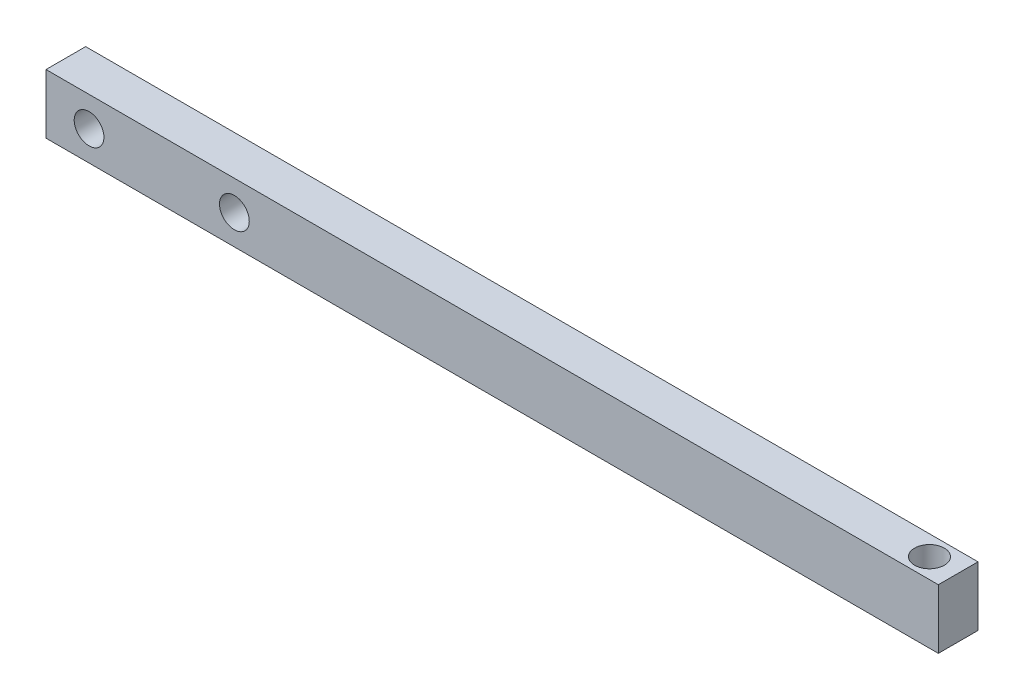
ISO-10303-21;
HEADER;
FILE_DESCRIPTION(('STEP AP214'),'2;1');
FILE_NAME('part.step','',(''),(''),'','','');
FILE_SCHEMA(('AUTOMOTIVE_DESIGN { 1 0 10303 214 1 1 1 1 }'));
ENDSEC;
DATA;
#1=APPLICATION_CONTEXT('core data for automotive mechanical design processes');
#2=APPLICATION_PROTOCOL_DEFINITION('international standard','automotive_design',2000,#1);
#3=PRODUCT_CONTEXT('',#1,'mechanical');
#4=PRODUCT('Part','Part','',(#3));
#5=PRODUCT_RELATED_PRODUCT_CATEGORY('part','',(#4));
#6=PRODUCT_DEFINITION_FORMATION('','',#4);
#7=PRODUCT_DEFINITION_CONTEXT('part definition',#1,'design');
#8=PRODUCT_DEFINITION('design','',#6,#7);
#9=PRODUCT_DEFINITION_SHAPE('','',#8);
#10=(LENGTH_UNIT() NAMED_UNIT(*) SI_UNIT(.MILLI.,.METRE.));
#11=(NAMED_UNIT(*) PLANE_ANGLE_UNIT() SI_UNIT($,.RADIAN.));
#12=(NAMED_UNIT(*) SI_UNIT($,.STERADIAN.) SOLID_ANGLE_UNIT());
#13=UNCERTAINTY_MEASURE_WITH_UNIT(LENGTH_MEASURE(1.E-05),#10,'distance_accuracy_value','');
#14=(GEOMETRIC_REPRESENTATION_CONTEXT(3) GLOBAL_UNCERTAINTY_ASSIGNED_CONTEXT((#13)) GLOBAL_UNIT_ASSIGNED_CONTEXT((#10,
#11,#12)) REPRESENTATION_CONTEXT('',''));
#15=CARTESIAN_POINT('',(0.,0.,0.));
#16=DIRECTION('',(0.,0.,1.));
#17=DIRECTION('',(1.,0.,0.));
#18=AXIS2_PLACEMENT_3D('',#15,#16,#17);
#19=CARTESIAN_POINT('',(508.,-38.0999999999999,50.8));
#20=DIRECTION('',(0.,1.,0.));
#21=DIRECTION('',(-1.,0.,0.));
#22=AXIS2_PLACEMENT_3D('',#19,#20,#21);
#23=PLANE('',#22);
#24=CARTESIAN_POINT('',(471.226971180447,-38.1000000000001,25.4));
#25=DIRECTION('',(0.,1.,0.));
#26=DIRECTION('',(-1.,0.,0.));
#27=AXIS2_PLACEMENT_3D('',#24,#25,#26);
#28=CIRCLE('',#27,19.05);
#29=CARTESIAN_POINT('',(452.176971180447,-38.1000000000001,25.4));
#30=VERTEX_POINT('',#29);
#31=EDGE_CURVE('E105',#30,#30,#28,.T.);
#32=ORIENTED_EDGE('',*,*,#31,.T.);
#33=EDGE_LOOP('',(#32));
#34=FACE_BOUND('',#33,.T.);
#35=DIRECTION('',(1.,0.,0.));
#36=VECTOR('',#35,1.);
#37=CARTESIAN_POINT('',(508.,-38.0999999999999,0.));
#38=LINE('',#37,#36);
#39=CARTESIAN_POINT('',(-635.,-38.1000000000001,0.));
#40=VERTEX_POINT('',#39);
#41=CARTESIAN_POINT('',(508.,-38.0999999999999,0.));
#42=VERTEX_POINT('',#41);
#43=EDGE_CURVE('E60',#40,#42,#38,.T.);
#44=ORIENTED_EDGE('',*,*,#43,.T.);
#45=DIRECTION('',(0.,0.,-1.));
#46=VECTOR('',#45,1.);
#47=CARTESIAN_POINT('',(508.,-38.0999999999999,50.8));
#48=LINE('',#47,#46);
#49=CARTESIAN_POINT('',(508.,-38.0999999999999,50.8));
#50=VERTEX_POINT('',#49);
#51=EDGE_CURVE('E11',#50,#42,#48,.T.);
#52=ORIENTED_EDGE('',*,*,#51,.F.);
#53=DIRECTION('',(1.,0.,0.));
#54=VECTOR('',#53,1.);
#55=CARTESIAN_POINT('',(508.,-38.0999999999999,50.8));
#56=LINE('',#55,#54);
#57=CARTESIAN_POINT('',(-635.,-38.1000000000001,50.8));
#58=VERTEX_POINT('',#57);
#59=EDGE_CURVE('E87',#58,#50,#56,.T.);
#60=ORIENTED_EDGE('',*,*,#59,.F.);
#61=DIRECTION('',(0.,0.,1.));
#62=VECTOR('',#61,1.);
#63=CARTESIAN_POINT('',(-635.,-38.1000000000001,0.));
#64=LINE('',#63,#62);
#65=EDGE_CURVE('E86',#40,#58,#64,.T.);
#66=ORIENTED_EDGE('',*,*,#65,.F.);
#67=EDGE_LOOP('',(#44,#52,#60,#66));
#68=FACE_BOUND('',#67,.T.);
#69=ADVANCED_FACE('F33',(#34,#68),#23,.F.);
#70=CARTESIAN_POINT('',(508.,-38.0999999999999,50.8));
#71=DIRECTION('',(-1.,0.,0.));
#72=DIRECTION('',(0.,0.,1.));
#73=AXIS2_PLACEMENT_3D('',#70,#71,#72);
#74=PLANE('',#73);
#75=DIRECTION('',(0.,1.,0.));
#76=VECTOR('',#75,1.);
#77=CARTESIAN_POINT('',(508.,-38.0999999999999,0.));
#78=LINE('',#77,#76);
#79=CARTESIAN_POINT('',(508.,38.1000000000001,0.));
#80=VERTEX_POINT('',#79);
#81=EDGE_CURVE('E82',#42,#80,#78,.T.);
#82=ORIENTED_EDGE('',*,*,#81,.T.);
#83=DIRECTION('',(0.,0.,-1.));
#84=VECTOR('',#83,1.);
#85=CARTESIAN_POINT('',(508.,38.1000000000001,50.8));
#86=LINE('',#85,#84);
#87=CARTESIAN_POINT('',(508.,38.1000000000001,50.8));
#88=VERTEX_POINT('',#87);
#89=EDGE_CURVE('E41',#88,#80,#86,.T.);
#90=ORIENTED_EDGE('',*,*,#89,.F.);
#91=DIRECTION('',(0.,1.,0.));
#92=VECTOR('',#91,1.);
#93=CARTESIAN_POINT('',(508.,-38.0999999999999,50.8));
#94=LINE('',#93,#92);
#95=EDGE_CURVE('E49',#50,#88,#94,.T.);
#96=ORIENTED_EDGE('',*,*,#95,.F.);
#97=ORIENTED_EDGE('',*,*,#51,.T.);
#98=EDGE_LOOP('',(#82,#90,#96,#97));
#99=FACE_BOUND('',#98,.T.);
#100=ADVANCED_FACE('F123',(#99),#74,.F.);
#101=CARTESIAN_POINT('',(508.,38.1000000000001,50.8));
#102=DIRECTION('',(0.,-1.,0.));
#103=DIRECTION('',(1.,0.,0.));
#104=AXIS2_PLACEMENT_3D('',#101,#102,#103);
#105=PLANE('',#104);
#106=CARTESIAN_POINT('',(471.226971180447,38.1000000000001,25.4));
#107=DIRECTION('',(0.,1.,0.));
#108=DIRECTION('',(-1.,0.,0.));
#109=AXIS2_PLACEMENT_3D('',#106,#107,#108);
#110=CIRCLE('',#109,19.05);
#111=CARTESIAN_POINT('',(452.176971180447,38.1000000000001,25.4));
#112=VERTEX_POINT('',#111);
#113=EDGE_CURVE('E104',#112,#112,#110,.T.);
#114=ORIENTED_EDGE('',*,*,#113,.F.);
#115=EDGE_LOOP('',(#114));
#116=FACE_BOUND('',#115,.T.);
#117=DIRECTION('',(-1.,0.,0.));
#118=VECTOR('',#117,1.);
#119=CARTESIAN_POINT('',(508.,38.1000000000001,0.));
#120=LINE('',#119,#118);
#121=CARTESIAN_POINT('',(-635.,38.0999999999999,0.));
#122=VERTEX_POINT('',#121);
#123=EDGE_CURVE('E68',#80,#122,#120,.T.);
#124=ORIENTED_EDGE('',*,*,#123,.T.);
#125=DIRECTION('',(0.,0.,-1.));
#126=VECTOR('',#125,1.);
#127=CARTESIAN_POINT('',(-635.,38.0999999999999,0.));
#128=LINE('',#127,#126);
#129=CARTESIAN_POINT('',(-635.,38.0999999999999,50.8));
#130=VERTEX_POINT('',#129);
#131=EDGE_CURVE('E94',#130,#122,#128,.T.);
#132=ORIENTED_EDGE('',*,*,#131,.F.);
#133=DIRECTION('',(-1.,0.,0.));
#134=VECTOR('',#133,1.);
#135=CARTESIAN_POINT('',(508.,38.1000000000001,50.8));
#136=LINE('',#135,#134);
#137=EDGE_CURVE('E117',#88,#130,#136,.T.);
#138=ORIENTED_EDGE('',*,*,#137,.F.);
#139=ORIENTED_EDGE('',*,*,#89,.T.);
#140=EDGE_LOOP('',(#124,#132,#138,#139));
#141=FACE_BOUND('',#140,.T.);
#142=ADVANCED_FACE('F121',(#116,#141),#105,.F.);
#143=CARTESIAN_POINT('',(0.,0.,50.8));
#144=DIRECTION('',(0.,0.,1.));
#145=DIRECTION('',(1.,0.,0.));
#146=AXIS2_PLACEMENT_3D('',#143,#144,#145);
#147=PLANE('',#146);
#148=CARTESIAN_POINT('',(-579.845937481373,0.,50.8));
#149=DIRECTION('',(0.,0.,1.));
#150=DIRECTION('',(1.,0.,0.));
#151=AXIS2_PLACEMENT_3D('',#148,#149,#150);
#152=CIRCLE('',#151,19.05);
#153=CARTESIAN_POINT('',(-560.795937481373,0.,50.8));
#154=VERTEX_POINT('',#153);
#155=EDGE_CURVE('E98',#154,#154,#152,.T.);
#156=ORIENTED_EDGE('',*,*,#155,.F.);
#157=EDGE_LOOP('',(#156));
#158=FACE_BOUND('',#157,.T.);
#159=CARTESIAN_POINT('',(-393.7,0.,50.8));
#160=DIRECTION('',(0.,0.,1.));
#161=DIRECTION('',(1.,0.,0.));
#162=AXIS2_PLACEMENT_3D('',#159,#160,#161);
#163=CIRCLE('',#162,19.05);
#164=CARTESIAN_POINT('',(-374.65,0.,50.8));
#165=VERTEX_POINT('',#164);
#166=EDGE_CURVE('E108',#165,#165,#163,.T.);
#167=ORIENTED_EDGE('',*,*,#166,.F.);
#168=EDGE_LOOP('',(#167));
#169=FACE_BOUND('',#168,.T.);
#170=ORIENTED_EDGE('',*,*,#137,.T.);
#171=DIRECTION('',(0.,1.,0.));
#172=VECTOR('',#171,1.);
#173=CARTESIAN_POINT('',(-635.,38.0999999999999,50.8));
#174=LINE('',#173,#172);
#175=EDGE_CURVE('E91',#58,#130,#174,.T.);
#176=ORIENTED_EDGE('',*,*,#175,.F.);
#177=ORIENTED_EDGE('',*,*,#59,.T.);
#178=ORIENTED_EDGE('',*,*,#95,.T.);
#179=EDGE_LOOP('',(#170,#176,#177,#178));
#180=FACE_BOUND('',#179,.T.);
#181=ADVANCED_FACE('F129',(#158,#169,#180),#147,.T.);
#182=CARTESIAN_POINT('',(0.,0.,0.));
#183=DIRECTION('',(0.,0.,1.));
#184=DIRECTION('',(1.,0.,0.));
#185=AXIS2_PLACEMENT_3D('',#182,#183,#184);
#186=PLANE('',#185);
#187=CARTESIAN_POINT('',(-579.845937481373,0.,0.));
#188=DIRECTION('',(0.,0.,1.));
#189=DIRECTION('',(1.,0.,0.));
#190=AXIS2_PLACEMENT_3D('',#187,#188,#189);
#191=CIRCLE('',#190,19.05);
#192=CARTESIAN_POINT('',(-560.795937481373,0.,0.));
#193=VERTEX_POINT('',#192);
#194=EDGE_CURVE('E95',#193,#193,#191,.T.);
#195=ORIENTED_EDGE('',*,*,#194,.T.);
#196=EDGE_LOOP('',(#195));
#197=FACE_BOUND('',#196,.T.);
#198=CARTESIAN_POINT('',(-393.7,0.,0.));
#199=DIRECTION('',(0.,0.,1.));
#200=DIRECTION('',(1.,0.,0.));
#201=AXIS2_PLACEMENT_3D('',#198,#199,#200);
#202=CIRCLE('',#201,19.05);
#203=CARTESIAN_POINT('',(-374.65,0.,0.));
#204=VERTEX_POINT('',#203);
#205=EDGE_CURVE('E83',#204,#204,#202,.T.);
#206=ORIENTED_EDGE('',*,*,#205,.T.);
#207=EDGE_LOOP('',(#206));
#208=FACE_BOUND('',#207,.T.);
#209=ORIENTED_EDGE('',*,*,#43,.F.);
#210=DIRECTION('',(0.,-1.,0.));
#211=VECTOR('',#210,1.);
#212=CARTESIAN_POINT('',(-635.,38.0999999999999,0.));
#213=LINE('',#212,#211);
#214=EDGE_CURVE('E81',#122,#40,#213,.T.);
#215=ORIENTED_EDGE('',*,*,#214,.F.);
#216=ORIENTED_EDGE('',*,*,#123,.F.);
#217=ORIENTED_EDGE('',*,*,#81,.F.);
#218=EDGE_LOOP('',(#209,#215,#216,#217));
#219=FACE_BOUND('',#218,.T.);
#220=ADVANCED_FACE('F79',(#197,#208,#219),#186,.F.);
#221=CARTESIAN_POINT('',(-393.7,0.,0.));
#222=DIRECTION('',(0.,0.,1.));
#223=DIRECTION('',(1.,0.,0.));
#224=AXIS2_PLACEMENT_3D('',#221,#222,#223);
#225=CYLINDRICAL_SURFACE('',#224,19.05);
#226=ORIENTED_EDGE('',*,*,#205,.F.);
#227=EDGE_LOOP('',(#226));
#228=FACE_BOUND('',#227,.T.);
#229=ORIENTED_EDGE('',*,*,#166,.T.);
#230=EDGE_LOOP('',(#229));
#231=FACE_BOUND('',#230,.T.);
#232=ADVANCED_FACE('F136',(#228,#231),#225,.F.);
#233=CARTESIAN_POINT('',(471.226971180447,-38.1000000000001,25.4));
#234=DIRECTION('',(0.,1.,0.));
#235=DIRECTION('',(-1.,0.,0.));
#236=AXIS2_PLACEMENT_3D('',#233,#234,#235);
#237=CYLINDRICAL_SURFACE('',#236,19.05);
#238=ORIENTED_EDGE('',*,*,#31,.F.);
#239=EDGE_LOOP('',(#238));
#240=FACE_BOUND('',#239,.T.);
#241=ORIENTED_EDGE('',*,*,#113,.T.);
#242=EDGE_LOOP('',(#241));
#243=FACE_BOUND('',#242,.T.);
#244=ADVANCED_FACE('F143',(#240,#243),#237,.F.);
#245=CARTESIAN_POINT('',(-635.,0.,0.));
#246=DIRECTION('',(-1.,0.,0.));
#247=DIRECTION('',(0.,0.,1.));
#248=AXIS2_PLACEMENT_3D('',#245,#246,#247);
#249=PLANE('',#248);
#250=ORIENTED_EDGE('',*,*,#214,.T.);
#251=ORIENTED_EDGE('',*,*,#65,.T.);
#252=ORIENTED_EDGE('',*,*,#175,.T.);
#253=ORIENTED_EDGE('',*,*,#131,.T.);
#254=EDGE_LOOP('',(#250,#251,#252,#253));
#255=FACE_BOUND('',#254,.T.);
#256=ADVANCED_FACE('F93',(#255),#249,.T.);
#257=CARTESIAN_POINT('',(-579.845937481373,0.,0.));
#258=DIRECTION('',(0.,0.,1.));
#259=DIRECTION('',(1.,0.,0.));
#260=AXIS2_PLACEMENT_3D('',#257,#258,#259);
#261=CYLINDRICAL_SURFACE('',#260,19.05);
#262=ORIENTED_EDGE('',*,*,#194,.F.);
#263=EDGE_LOOP('',(#262));
#264=FACE_BOUND('',#263,.T.);
#265=ORIENTED_EDGE('',*,*,#155,.T.);
#266=EDGE_LOOP('',(#265));
#267=FACE_BOUND('',#266,.T.);
#268=ADVANCED_FACE('F150',(#264,#267),#261,.F.);
#269=CLOSED_SHELL('',(#69,#100,#142,#181,#220,#232,#244,#256,#268));
#270=MANIFOLD_SOLID_BREP('B2',#269);
#271=ADVANCED_BREP_SHAPE_REPRESENTATION('',(#18,#270),#14);
#272=SHAPE_DEFINITION_REPRESENTATION(#9,#271);
ENDSEC;
END-ISO-10303-21;
